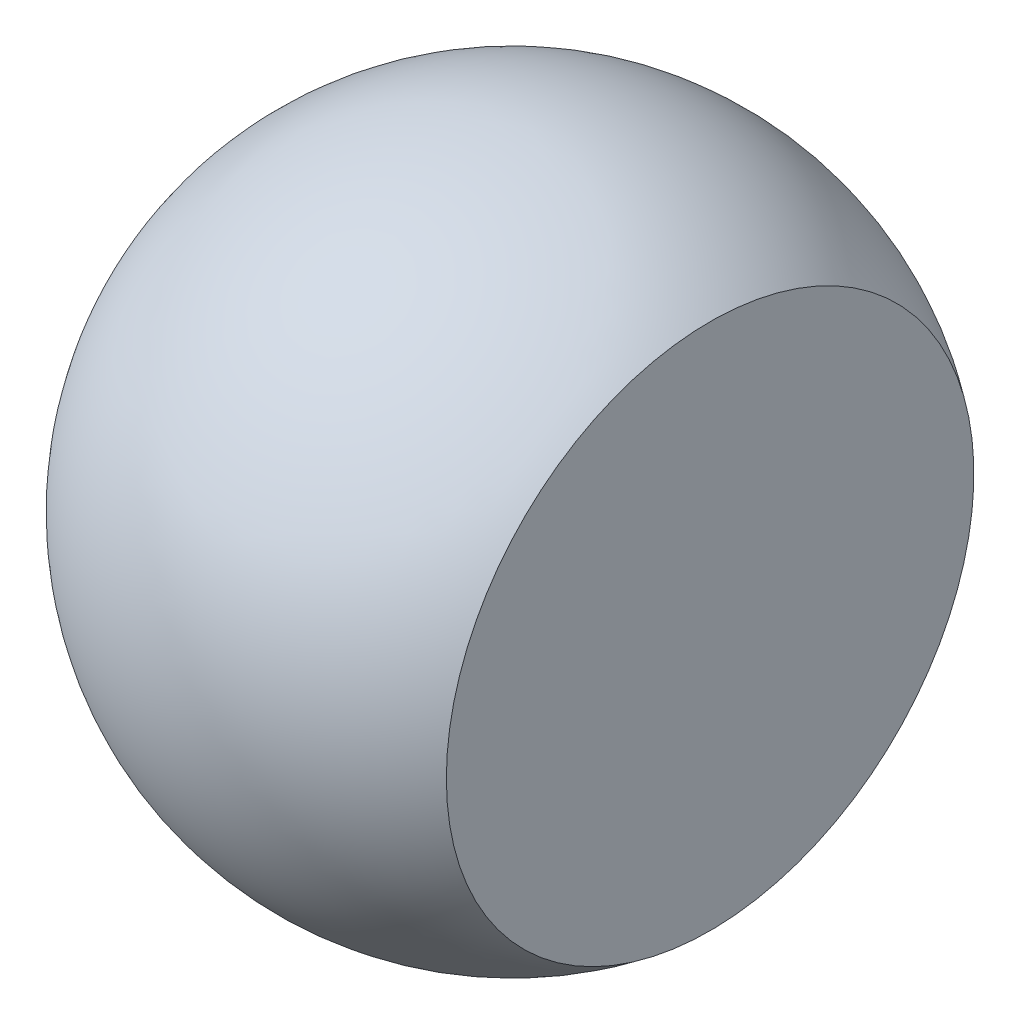
ISO-10303-21;
HEADER;
FILE_DESCRIPTION(('STEP AP214'),'2;1');
FILE_NAME('part.step','',(''),(''),'','','');
FILE_SCHEMA(('AUTOMOTIVE_DESIGN { 1 0 10303 214 1 1 1 1 }'));
ENDSEC;
DATA;
#1=APPLICATION_CONTEXT('core data for automotive mechanical design processes');
#2=APPLICATION_PROTOCOL_DEFINITION('international standard','automotive_design',2000,#1);
#3=PRODUCT_CONTEXT('',#1,'mechanical');
#4=PRODUCT('Part','Part','',(#3));
#5=PRODUCT_RELATED_PRODUCT_CATEGORY('part','',(#4));
#6=PRODUCT_DEFINITION_FORMATION('','',#4);
#7=PRODUCT_DEFINITION_CONTEXT('part definition',#1,'design');
#8=PRODUCT_DEFINITION('design','',#6,#7);
#9=PRODUCT_DEFINITION_SHAPE('','',#8);
#10=(LENGTH_UNIT() NAMED_UNIT(*) SI_UNIT(.MILLI.,.METRE.));
#11=(NAMED_UNIT(*) PLANE_ANGLE_UNIT() SI_UNIT($,.RADIAN.));
#12=(NAMED_UNIT(*) SI_UNIT($,.STERADIAN.) SOLID_ANGLE_UNIT());
#13=UNCERTAINTY_MEASURE_WITH_UNIT(LENGTH_MEASURE(1.E-05),#10,'distance_accuracy_value','');
#14=(GEOMETRIC_REPRESENTATION_CONTEXT(3) GLOBAL_UNCERTAINTY_ASSIGNED_CONTEXT((#13)) GLOBAL_UNIT_ASSIGNED_CONTEXT((#10,
#11,#12)) REPRESENTATION_CONTEXT('',''));
#15=CARTESIAN_POINT('',(0.,0.,0.));
#16=DIRECTION('',(0.,0.,1.));
#17=DIRECTION('',(1.,0.,0.));
#18=AXIS2_PLACEMENT_3D('',#15,#16,#17);
#19=CARTESIAN_POINT('',(-238.930478107692,-1.89942491050567,203.029705971872));
#20=DIRECTION('',(-1.,0.,0.));
#21=DIRECTION('',(0.,0.,1.));
#22=AXIS2_PLACEMENT_3D('',#19,#20,#21);
#23=PLANE('',#22);
#24=CARTESIAN_POINT('',(-238.930478107692,-1.89942491050567,203.029705971872));
#25=DIRECTION('',(-1.,0.,0.));
#26=DIRECTION('',(0.,0.,1.));
#27=AXIS2_PLACEMENT_3D('',#24,#25,#26);
#28=CIRCLE('',#27,14.636778257238);
#29=CARTESIAN_POINT('',(-238.930478107692,-1.89942491050567,217.66648422911));
#30=VERTEX_POINT('',#29);
#31=EDGE_CURVE('E10',#30,#30,#28,.T.);
#32=ORIENTED_EDGE('',*,*,#31,.F.);
#33=EDGE_LOOP('',(#32));
#34=FACE_BOUND('',#33,.T.);
#35=ADVANCED_FACE('F39',(#34),#23,.F.);
#36=CARTESIAN_POINT('',(-249.903023282235,-1.89942491050567,203.029705971872));
#37=DIRECTION('',(-1.,0.,0.));
#38=DIRECTION('',(0.,0.990345441681139,0.138621449066841));
#39=AXIS2_PLACEMENT_3D('',#36,#37,#38);
#40=SPHERICAL_SURFACE('',#39,18.2929501546068);
#41=ORIENTED_EDGE('',*,*,#31,.T.);
#42=EDGE_LOOP('',(#41));
#43=FACE_BOUND('',#42,.T.);
#44=ADVANCED_FACE('F46',(#43),#40,.T.);
#45=CLOSED_SHELL('',(#35,#44));
#46=MANIFOLD_SOLID_BREP('B2',#45);
#47=ADVANCED_BREP_SHAPE_REPRESENTATION('',(#18,#46),#14);
#48=SHAPE_DEFINITION_REPRESENTATION(#9,#47);
ENDSEC;
END-ISO-10303-21;
